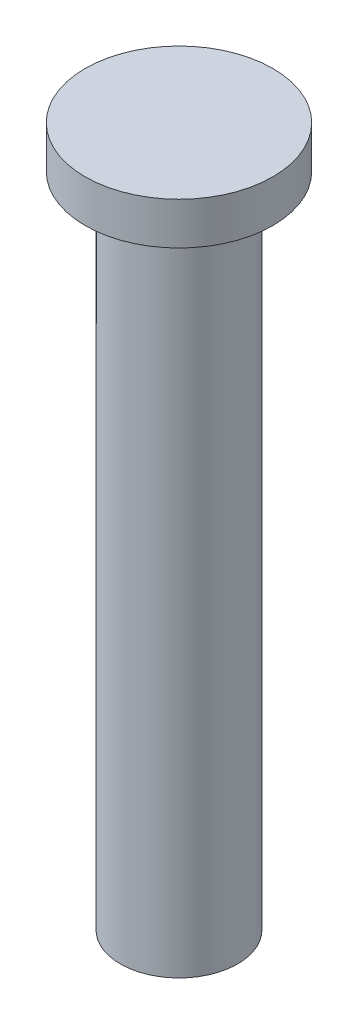
ISO-10303-21;
HEADER;
FILE_DESCRIPTION(('STEP AP214'),'2;1');
FILE_NAME('part.step','',(''),(''),'','','');
FILE_SCHEMA(('AUTOMOTIVE_DESIGN { 1 0 10303 214 1 1 1 1 }'));
ENDSEC;
DATA;
#1=APPLICATION_CONTEXT('core data for automotive mechanical design processes');
#2=APPLICATION_PROTOCOL_DEFINITION('international standard','automotive_design',2000,#1);
#3=PRODUCT_CONTEXT('',#1,'mechanical');
#4=PRODUCT('Part','Part','',(#3));
#5=PRODUCT_RELATED_PRODUCT_CATEGORY('part','',(#4));
#6=PRODUCT_DEFINITION_FORMATION('','',#4);
#7=PRODUCT_DEFINITION_CONTEXT('part definition',#1,'design');
#8=PRODUCT_DEFINITION('design','',#6,#7);
#9=PRODUCT_DEFINITION_SHAPE('','',#8);
#10=(LENGTH_UNIT() NAMED_UNIT(*) SI_UNIT(.MILLI.,.METRE.));
#11=(NAMED_UNIT(*) PLANE_ANGLE_UNIT() SI_UNIT($,.RADIAN.));
#12=(NAMED_UNIT(*) SI_UNIT($,.STERADIAN.) SOLID_ANGLE_UNIT());
#13=UNCERTAINTY_MEASURE_WITH_UNIT(LENGTH_MEASURE(1.E-05),#10,'distance_accuracy_value','');
#14=(GEOMETRIC_REPRESENTATION_CONTEXT(3) GLOBAL_UNCERTAINTY_ASSIGNED_CONTEXT((#13)) GLOBAL_UNIT_ASSIGNED_CONTEXT((#10,
#11,#12)) REPRESENTATION_CONTEXT('',''));
#15=CARTESIAN_POINT('',(0.,0.,0.));
#16=DIRECTION('',(0.,0.,1.));
#17=DIRECTION('',(1.,0.,0.));
#18=AXIS2_PLACEMENT_3D('',#15,#16,#17);
#19=CARTESIAN_POINT('',(2.,0.,0.));
#20=DIRECTION('',(0.,-1.,0.));
#21=DIRECTION('',(1.,0.,0.));
#22=AXIS2_PLACEMENT_3D('',#19,#20,#21);
#23=PLANE('',#22);
#24=CARTESIAN_POINT('',(0.,0.,0.));
#25=DIRECTION('',(0.,1.,0.));
#26=DIRECTION('',(-1.,0.,0.));
#27=AXIS2_PLACEMENT_3D('',#24,#25,#26);
#28=CIRCLE('',#27,2.);
#29=CARTESIAN_POINT('',(-2.,0.,0.));
#30=VERTEX_POINT('',#29);
#31=EDGE_CURVE('E53',#30,#30,#28,.T.);
#32=ORIENTED_EDGE('',*,*,#31,.T.);
#33=EDGE_LOOP('',(#32));
#34=FACE_BOUND('',#33,.T.);
#35=ADVANCED_FACE('F39',(#34),#23,.F.);
#36=CARTESIAN_POINT('',(0.,-14.9,0.));
#37=DIRECTION('',(0.,1.,0.));
#38=DIRECTION('',(-1.,0.,0.));
#39=AXIS2_PLACEMENT_3D('',#36,#37,#38);
#40=PLANE('',#39);
#41=CARTESIAN_POINT('',(0.,-14.9,0.));
#42=DIRECTION('',(0.,1.,0.));
#43=DIRECTION('',(-1.,0.,0.));
#44=AXIS2_PLACEMENT_3D('',#41,#42,#43);
#45=CIRCLE('',#44,1.25);
#46=CARTESIAN_POINT('',(-1.24999999999999,-14.9,0.));
#47=VERTEX_POINT('',#46);
#48=EDGE_CURVE('E10',#47,#47,#45,.T.);
#49=ORIENTED_EDGE('',*,*,#48,.F.);
#50=EDGE_LOOP('',(#49));
#51=FACE_BOUND('',#50,.T.);
#52=ADVANCED_FACE('F73',(#51),#40,.F.);
#53=CARTESIAN_POINT('',(0.,0.,0.));
#54=DIRECTION('',(0.,1.,0.));
#55=DIRECTION('',(-1.,0.,0.));
#56=AXIS2_PLACEMENT_3D('',#53,#54,#55);
#57=CYLINDRICAL_SURFACE('',#56,1.25);
#58=CARTESIAN_POINT('',(0.,-0.900000000000001,0.));
#59=DIRECTION('',(0.,1.,0.));
#60=DIRECTION('',(-1.,0.,0.));
#61=AXIS2_PLACEMENT_3D('',#58,#59,#60);
#62=CIRCLE('',#61,1.25);
#63=CARTESIAN_POINT('',(-1.25,-0.900000000000002,0.));
#64=VERTEX_POINT('',#63);
#65=EDGE_CURVE('E45',#64,#64,#62,.T.);
#66=ORIENTED_EDGE('',*,*,#65,.F.);
#67=EDGE_LOOP('',(#66));
#68=FACE_BOUND('',#67,.T.);
#69=ORIENTED_EDGE('',*,*,#48,.T.);
#70=EDGE_LOOP('',(#69));
#71=FACE_BOUND('',#70,.T.);
#72=ADVANCED_FACE('F68',(#68,#71),#57,.T.);
#73=CARTESIAN_POINT('',(1.25,-0.9,0.));
#74=DIRECTION('',(0.,1.,0.));
#75=DIRECTION('',(-1.,0.,0.));
#76=AXIS2_PLACEMENT_3D('',#73,#74,#75);
#77=PLANE('',#76);
#78=CARTESIAN_POINT('',(0.,-0.9,0.));
#79=DIRECTION('',(0.,1.,0.));
#80=DIRECTION('',(-1.,0.,0.));
#81=AXIS2_PLACEMENT_3D('',#78,#79,#80);
#82=CIRCLE('',#81,2.);
#83=CARTESIAN_POINT('',(-2.,-0.900000000000001,0.));
#84=VERTEX_POINT('',#83);
#85=EDGE_CURVE('E49',#84,#84,#82,.T.);
#86=ORIENTED_EDGE('',*,*,#85,.F.);
#87=EDGE_LOOP('',(#86));
#88=FACE_BOUND('',#87,.T.);
#89=ORIENTED_EDGE('',*,*,#65,.T.);
#90=EDGE_LOOP('',(#89));
#91=FACE_BOUND('',#90,.T.);
#92=ADVANCED_FACE('F63',(#88,#91),#77,.F.);
#93=CARTESIAN_POINT('',(0.,0.,0.));
#94=DIRECTION('',(0.,1.,0.));
#95=DIRECTION('',(-1.,0.,0.));
#96=AXIS2_PLACEMENT_3D('',#93,#94,#95);
#97=CYLINDRICAL_SURFACE('',#96,2.);
#98=ORIENTED_EDGE('',*,*,#31,.F.);
#99=EDGE_LOOP('',(#98));
#100=FACE_BOUND('',#99,.T.);
#101=ORIENTED_EDGE('',*,*,#85,.T.);
#102=EDGE_LOOP('',(#101));
#103=FACE_BOUND('',#102,.T.);
#104=ADVANCED_FACE('F60',(#100,#103),#97,.T.);
#105=CLOSED_SHELL('',(#35,#52,#72,#92,#104));
#106=MANIFOLD_SOLID_BREP('B2',#105);
#107=ADVANCED_BREP_SHAPE_REPRESENTATION('',(#18,#106),#14);
#108=SHAPE_DEFINITION_REPRESENTATION(#9,#107);
ENDSEC;
END-ISO-10303-21;
